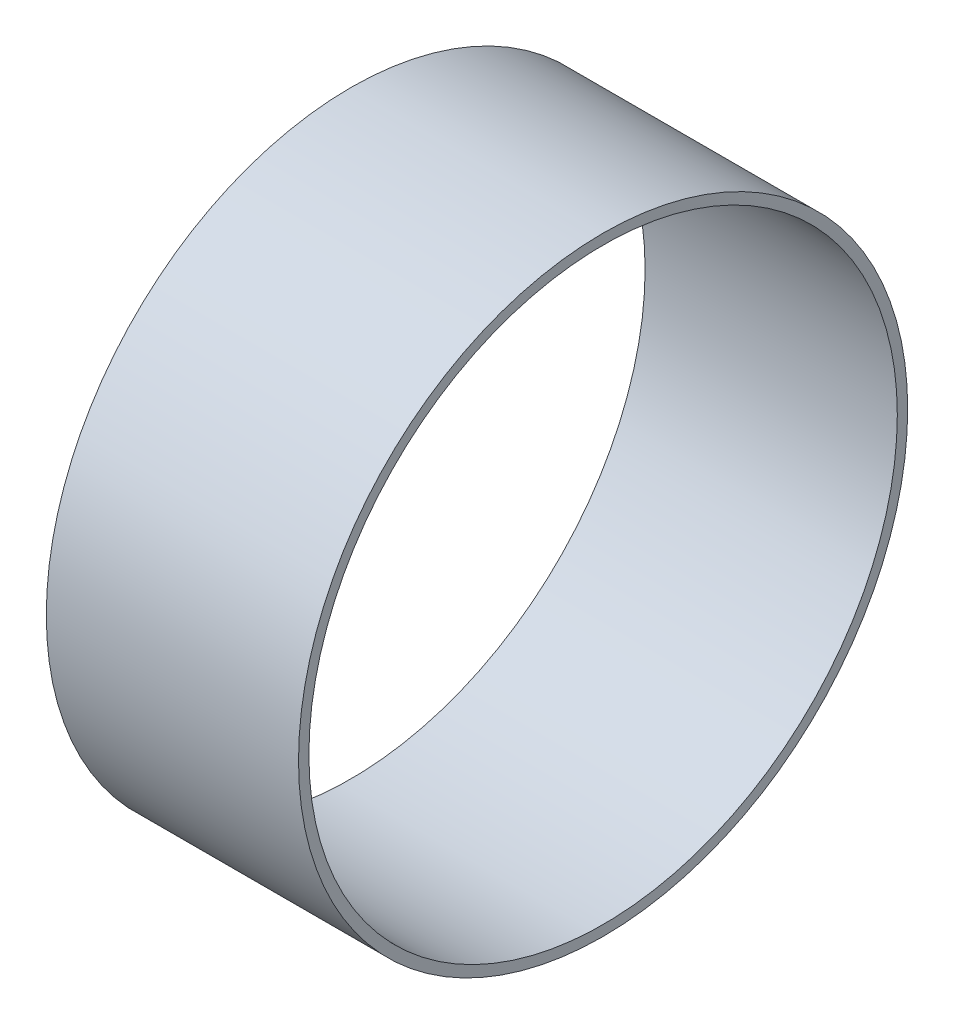
ISO-10303-21;
HEADER;
FILE_DESCRIPTION(('STEP AP214'),'2;1');
FILE_NAME('part.step','',(''),(''),'','','');
FILE_SCHEMA(('AUTOMOTIVE_DESIGN { 1 0 10303 214 1 1 1 1 }'));
ENDSEC;
DATA;
#1=APPLICATION_CONTEXT('core data for automotive mechanical design processes');
#2=APPLICATION_PROTOCOL_DEFINITION('international standard','automotive_design',2000,#1);
#3=PRODUCT_CONTEXT('',#1,'mechanical');
#4=PRODUCT('Part','Part','',(#3));
#5=PRODUCT_RELATED_PRODUCT_CATEGORY('part','',(#4));
#6=PRODUCT_DEFINITION_FORMATION('','',#4);
#7=PRODUCT_DEFINITION_CONTEXT('part definition',#1,'design');
#8=PRODUCT_DEFINITION('design','',#6,#7);
#9=PRODUCT_DEFINITION_SHAPE('','',#8);
#10=(LENGTH_UNIT() NAMED_UNIT(*) SI_UNIT(.MILLI.,.METRE.));
#11=(NAMED_UNIT(*) PLANE_ANGLE_UNIT() SI_UNIT($,.RADIAN.));
#12=(NAMED_UNIT(*) SI_UNIT($,.STERADIAN.) SOLID_ANGLE_UNIT());
#13=UNCERTAINTY_MEASURE_WITH_UNIT(LENGTH_MEASURE(1.E-05),#10,'distance_accuracy_value','');
#14=(GEOMETRIC_REPRESENTATION_CONTEXT(3) GLOBAL_UNCERTAINTY_ASSIGNED_CONTEXT((#13)) GLOBAL_UNIT_ASSIGNED_CONTEXT((#10,
#11,#12)) REPRESENTATION_CONTEXT('',''));
#15=CARTESIAN_POINT('',(0.,0.,0.));
#16=DIRECTION('',(0.,0.,1.));
#17=DIRECTION('',(1.,0.,0.));
#18=AXIS2_PLACEMENT_3D('',#15,#16,#17);
#19=CARTESIAN_POINT('',(-80.61250008,0.,-23.29375));
#20=DIRECTION('',(1.,0.,0.));
#21=DIRECTION('',(0.,0.,-1.));
#22=AXIS2_PLACEMENT_3D('',#19,#20,#21);
#23=PLANE('',#22);
#24=CARTESIAN_POINT('',(-80.61250008,0.,0.));
#25=DIRECTION('',(1.,0.,0.));
#26=DIRECTION('',(0.,0.,-1.));
#27=AXIS2_PLACEMENT_3D('',#24,#25,#26);
#28=CIRCLE('',#27,23.29375);
#29=CARTESIAN_POINT('',(-80.61250008,0.,-23.29375));
#30=VERTEX_POINT('',#29);
#31=EDGE_CURVE('E51',#30,#30,#28,.T.);
#32=ORIENTED_EDGE('',*,*,#31,.T.);
#33=EDGE_LOOP('',(#32));
#34=FACE_BOUND('',#33,.T.);
#35=CARTESIAN_POINT('',(-80.61250008,0.,0.));
#36=DIRECTION('',(1.,0.,0.));
#37=DIRECTION('',(0.,0.,-1.));
#38=AXIS2_PLACEMENT_3D('',#35,#36,#37);
#39=CIRCLE('',#38,22.5);
#40=CARTESIAN_POINT('',(-80.61250008,0.,-22.5));
#41=VERTEX_POINT('',#40);
#42=EDGE_CURVE('E10',#41,#41,#39,.T.);
#43=ORIENTED_EDGE('',*,*,#42,.F.);
#44=EDGE_LOOP('',(#43));
#45=FACE_BOUND('',#44,.T.);
#46=ADVANCED_FACE('F35',(#34,#45),#23,.T.);
#47=CARTESIAN_POINT('',(-79.6481250823,0.,0.));
#48=DIRECTION('',(1.,0.,0.));
#49=DIRECTION('',(0.,0.,-1.));
#50=AXIS2_PLACEMENT_3D('',#47,#48,#49);
#51=CYLINDRICAL_SURFACE('',#50,22.5);
#52=ORIENTED_EDGE('',*,*,#42,.T.);
#53=EDGE_LOOP('',(#52));
#54=FACE_BOUND('',#53,.T.);
#55=CARTESIAN_POINT('',(-99.900000034,0.,0.));
#56=DIRECTION('',(1.,0.,0.));
#57=DIRECTION('',(0.,0.,-1.));
#58=AXIS2_PLACEMENT_3D('',#55,#56,#57);
#59=CIRCLE('',#58,22.5);
#60=CARTESIAN_POINT('',(-99.900000034,0.,-22.5));
#61=VERTEX_POINT('',#60);
#62=EDGE_CURVE('E42',#61,#61,#59,.T.);
#63=ORIENTED_EDGE('',*,*,#62,.F.);
#64=EDGE_LOOP('',(#63));
#65=FACE_BOUND('',#64,.T.);
#66=ADVANCED_FACE('F67',(#54,#65),#51,.F.);
#67=CARTESIAN_POINT('',(-99.900000034,0.,-23.29375));
#68=DIRECTION('',(-1.,0.,0.));
#69=DIRECTION('',(0.,0.,1.));
#70=AXIS2_PLACEMENT_3D('',#67,#68,#69);
#71=PLANE('',#70);
#72=ORIENTED_EDGE('',*,*,#62,.T.);
#73=EDGE_LOOP('',(#72));
#74=FACE_BOUND('',#73,.T.);
#75=CARTESIAN_POINT('',(-99.900000034,0.,0.));
#76=DIRECTION('',(1.,0.,0.));
#77=DIRECTION('',(0.,0.,-1.));
#78=AXIS2_PLACEMENT_3D('',#75,#76,#77);
#79=CIRCLE('',#78,23.29375);
#80=CARTESIAN_POINT('',(-99.900000034,0.,-23.29375));
#81=VERTEX_POINT('',#80);
#82=EDGE_CURVE('E47',#81,#81,#79,.T.);
#83=ORIENTED_EDGE('',*,*,#82,.F.);
#84=EDGE_LOOP('',(#83));
#85=FACE_BOUND('',#84,.T.);
#86=ADVANCED_FACE('F61',(#74,#85),#71,.T.);
#87=CARTESIAN_POINT('',(-79.6481250823,0.,0.));
#88=DIRECTION('',(1.,0.,0.));
#89=DIRECTION('',(0.,0.,-1.));
#90=AXIS2_PLACEMENT_3D('',#87,#88,#89);
#91=CYLINDRICAL_SURFACE('',#90,23.29375);
#92=ORIENTED_EDGE('',*,*,#82,.T.);
#93=EDGE_LOOP('',(#92));
#94=FACE_BOUND('',#93,.T.);
#95=ORIENTED_EDGE('',*,*,#31,.F.);
#96=EDGE_LOOP('',(#95));
#97=FACE_BOUND('',#96,.T.);
#98=ADVANCED_FACE('F59',(#94,#97),#91,.T.);
#99=CLOSED_SHELL('',(#46,#66,#86,#98));
#100=MANIFOLD_SOLID_BREP('B2',#99);
#101=ADVANCED_BREP_SHAPE_REPRESENTATION('',(#18,#100),#14);
#102=SHAPE_DEFINITION_REPRESENTATION(#9,#101);
ENDSEC;
END-ISO-10303-21;
